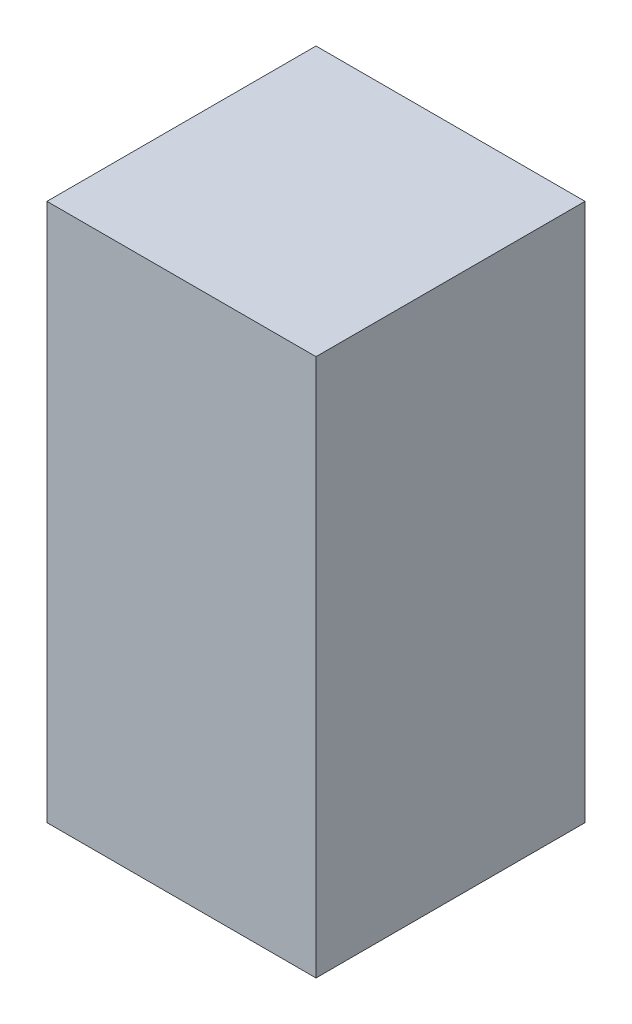
ISO-10303-21;
HEADER;
FILE_DESCRIPTION(('STEP AP214'),'2;1');
FILE_NAME('part.step','',(''),(''),'','','');
FILE_SCHEMA(('AUTOMOTIVE_DESIGN { 1 0 10303 214 1 1 1 1 }'));
ENDSEC;
DATA;
#1=APPLICATION_CONTEXT('core data for automotive mechanical design processes');
#2=APPLICATION_PROTOCOL_DEFINITION('international standard','automotive_design',2000,#1);
#3=PRODUCT_CONTEXT('',#1,'mechanical');
#4=PRODUCT('Part','Part','',(#3));
#5=PRODUCT_RELATED_PRODUCT_CATEGORY('part','',(#4));
#6=PRODUCT_DEFINITION_FORMATION('','',#4);
#7=PRODUCT_DEFINITION_CONTEXT('part definition',#1,'design');
#8=PRODUCT_DEFINITION('design','',#6,#7);
#9=PRODUCT_DEFINITION_SHAPE('','',#8);
#10=(LENGTH_UNIT() NAMED_UNIT(*) SI_UNIT(.MILLI.,.METRE.));
#11=(NAMED_UNIT(*) PLANE_ANGLE_UNIT() SI_UNIT($,.RADIAN.));
#12=(NAMED_UNIT(*) SI_UNIT($,.STERADIAN.) SOLID_ANGLE_UNIT());
#13=UNCERTAINTY_MEASURE_WITH_UNIT(LENGTH_MEASURE(1.E-05),#10,'distance_accuracy_value','');
#14=(GEOMETRIC_REPRESENTATION_CONTEXT(3) GLOBAL_UNCERTAINTY_ASSIGNED_CONTEXT((#13)) GLOBAL_UNIT_ASSIGNED_CONTEXT((#10,
#11,#12)) REPRESENTATION_CONTEXT('',''));
#15=CARTESIAN_POINT('',(0.,0.,0.));
#16=DIRECTION('',(0.,0.,1.));
#17=DIRECTION('',(1.,0.,0.));
#18=AXIS2_PLACEMENT_3D('',#15,#16,#17);
#19=CARTESIAN_POINT('',(-75.,300.,-75.));
#20=DIRECTION('',(1.,0.,0.));
#21=DIRECTION('',(0.,0.,-1.));
#22=AXIS2_PLACEMENT_3D('',#19,#20,#21);
#23=PLANE('',#22);
#24=DIRECTION('',(0.,0.,1.));
#25=VECTOR('',#24,1.);
#26=CARTESIAN_POINT('',(-75.,0.,-75.));
#27=LINE('',#26,#25);
#28=CARTESIAN_POINT('',(-75.,0.,-75.));
#29=VERTEX_POINT('',#28);
#30=CARTESIAN_POINT('',(-75.,0.,75.));
#31=VERTEX_POINT('',#30);
#32=EDGE_CURVE('E107',#29,#31,#27,.T.);
#33=ORIENTED_EDGE('',*,*,#32,.T.);
#34=DIRECTION('',(0.,-1.,0.));
#35=VECTOR('',#34,1.);
#36=CARTESIAN_POINT('',(-75.,300.,75.));
#37=LINE('',#36,#35);
#38=CARTESIAN_POINT('',(-75.,300.,75.));
#39=VERTEX_POINT('',#38);
#40=EDGE_CURVE('E11',#39,#31,#37,.T.);
#41=ORIENTED_EDGE('',*,*,#40,.F.);
#42=DIRECTION('',(0.,0.,1.));
#43=VECTOR('',#42,1.);
#44=CARTESIAN_POINT('',(-75.,300.,-75.));
#45=LINE('',#44,#43);
#46=CARTESIAN_POINT('',(-75.,300.,-75.));
#47=VERTEX_POINT('',#46);
#48=EDGE_CURVE('E91',#47,#39,#45,.T.);
#49=ORIENTED_EDGE('',*,*,#48,.F.);
#50=DIRECTION('',(0.,-1.,0.));
#51=VECTOR('',#50,1.);
#52=CARTESIAN_POINT('',(-75.,300.,-75.));
#53=LINE('',#52,#51);
#54=EDGE_CURVE('E103',#47,#29,#53,.T.);
#55=ORIENTED_EDGE('',*,*,#54,.T.);
#56=EDGE_LOOP('',(#33,#41,#49,#55));
#57=FACE_BOUND('',#56,.T.);
#58=ADVANCED_FACE('F39',(#57),#23,.F.);
#59=CARTESIAN_POINT('',(-75.,300.,75.));
#60=DIRECTION('',(0.,0.,-1.));
#61=DIRECTION('',(-1.,0.,0.));
#62=AXIS2_PLACEMENT_3D('',#59,#60,#61);
#63=PLANE('',#62);
#64=DIRECTION('',(1.,0.,0.));
#65=VECTOR('',#64,1.);
#66=CARTESIAN_POINT('',(-75.,0.,75.));
#67=LINE('',#66,#65);
#68=CARTESIAN_POINT('',(75.,0.,75.));
#69=VERTEX_POINT('',#68);
#70=EDGE_CURVE('E96',#31,#69,#67,.T.);
#71=ORIENTED_EDGE('',*,*,#70,.T.);
#72=DIRECTION('',(0.,-1.,0.));
#73=VECTOR('',#72,1.);
#74=CARTESIAN_POINT('',(75.,300.,75.));
#75=LINE('',#74,#73);
#76=CARTESIAN_POINT('',(75.,300.,75.));
#77=VERTEX_POINT('',#76);
#78=EDGE_CURVE('E48',#77,#69,#75,.T.);
#79=ORIENTED_EDGE('',*,*,#78,.F.);
#80=DIRECTION('',(1.,0.,0.));
#81=VECTOR('',#80,1.);
#82=CARTESIAN_POINT('',(-75.,300.,75.));
#83=LINE('',#82,#81);
#84=EDGE_CURVE('E86',#39,#77,#83,.T.);
#85=ORIENTED_EDGE('',*,*,#84,.F.);
#86=ORIENTED_EDGE('',*,*,#40,.T.);
#87=EDGE_LOOP('',(#71,#79,#85,#86));
#88=FACE_BOUND('',#87,.T.);
#89=ADVANCED_FACE('F95',(#88),#63,.F.);
#90=CARTESIAN_POINT('',(75.,300.,-75.));
#91=DIRECTION('',(-1.,0.,0.));
#92=DIRECTION('',(0.,0.,1.));
#93=AXIS2_PLACEMENT_3D('',#90,#91,#92);
#94=PLANE('',#93);
#95=DIRECTION('',(0.,0.,-1.));
#96=VECTOR('',#95,1.);
#97=CARTESIAN_POINT('',(75.,0.,-75.));
#98=LINE('',#97,#96);
#99=CARTESIAN_POINT('',(75.,0.,-75.));
#100=VERTEX_POINT('',#99);
#101=EDGE_CURVE('E73',#69,#100,#98,.T.);
#102=ORIENTED_EDGE('',*,*,#101,.T.);
#103=DIRECTION('',(0.,-1.,0.));
#104=VECTOR('',#103,1.);
#105=CARTESIAN_POINT('',(75.,300.,-75.));
#106=LINE('',#105,#104);
#107=CARTESIAN_POINT('',(75.,300.,-75.));
#108=VERTEX_POINT('',#107);
#109=EDGE_CURVE('E98',#108,#100,#106,.T.);
#110=ORIENTED_EDGE('',*,*,#109,.F.);
#111=DIRECTION('',(0.,0.,-1.));
#112=VECTOR('',#111,1.);
#113=CARTESIAN_POINT('',(75.,300.,-75.));
#114=LINE('',#113,#112);
#115=EDGE_CURVE('E89',#77,#108,#114,.T.);
#116=ORIENTED_EDGE('',*,*,#115,.F.);
#117=ORIENTED_EDGE('',*,*,#78,.T.);
#118=EDGE_LOOP('',(#102,#110,#116,#117));
#119=FACE_BOUND('',#118,.T.);
#120=ADVANCED_FACE('F99',(#119),#94,.F.);
#121=CARTESIAN_POINT('',(-75.,300.,-75.));
#122=DIRECTION('',(0.,0.,1.));
#123=DIRECTION('',(1.,0.,0.));
#124=AXIS2_PLACEMENT_3D('',#121,#122,#123);
#125=PLANE('',#124);
#126=DIRECTION('',(-1.,0.,0.));
#127=VECTOR('',#126,1.);
#128=CARTESIAN_POINT('',(-75.,0.,-75.));
#129=LINE('',#128,#127);
#130=EDGE_CURVE('E79',#100,#29,#129,.T.);
#131=ORIENTED_EDGE('',*,*,#130,.T.);
#132=ORIENTED_EDGE('',*,*,#54,.F.);
#133=DIRECTION('',(-1.,0.,0.));
#134=VECTOR('',#133,1.);
#135=CARTESIAN_POINT('',(-75.,300.,-75.));
#136=LINE('',#135,#134);
#137=EDGE_CURVE('E56',#108,#47,#136,.T.);
#138=ORIENTED_EDGE('',*,*,#137,.F.);
#139=ORIENTED_EDGE('',*,*,#109,.T.);
#140=EDGE_LOOP('',(#131,#132,#138,#139));
#141=FACE_BOUND('',#140,.T.);
#142=ADVANCED_FACE('F120',(#141),#125,.F.);
#143=CARTESIAN_POINT('',(0.,300.,0.));
#144=DIRECTION('',(0.,1.,0.));
#145=DIRECTION('',(0.,0.,1.));
#146=AXIS2_PLACEMENT_3D('',#143,#144,#145);
#147=PLANE('',#146);
#148=ORIENTED_EDGE('',*,*,#48,.T.);
#149=ORIENTED_EDGE('',*,*,#84,.T.);
#150=ORIENTED_EDGE('',*,*,#115,.T.);
#151=ORIENTED_EDGE('',*,*,#137,.T.);
#152=EDGE_LOOP('',(#148,#149,#150,#151));
#153=FACE_BOUND('',#152,.T.);
#154=ADVANCED_FACE('F87',(#153),#147,.T.);
#155=CARTESIAN_POINT('',(0.,0.,0.));
#156=DIRECTION('',(0.,1.,0.));
#157=DIRECTION('',(0.,0.,1.));
#158=AXIS2_PLACEMENT_3D('',#155,#156,#157);
#159=PLANE('',#158);
#160=ORIENTED_EDGE('',*,*,#32,.F.);
#161=ORIENTED_EDGE('',*,*,#130,.F.);
#162=ORIENTED_EDGE('',*,*,#101,.F.);
#163=ORIENTED_EDGE('',*,*,#70,.F.);
#164=EDGE_LOOP('',(#160,#161,#162,#163));
#165=FACE_BOUND('',#164,.T.);
#166=ADVANCED_FACE('F123',(#165),#159,.F.);
#167=CLOSED_SHELL('',(#58,#89,#120,#142,#154,#166));
#168=MANIFOLD_SOLID_BREP('B2',#167);
#169=ADVANCED_BREP_SHAPE_REPRESENTATION('',(#18,#168),#14);
#170=SHAPE_DEFINITION_REPRESENTATION(#9,#169);
ENDSEC;
END-ISO-10303-21;
